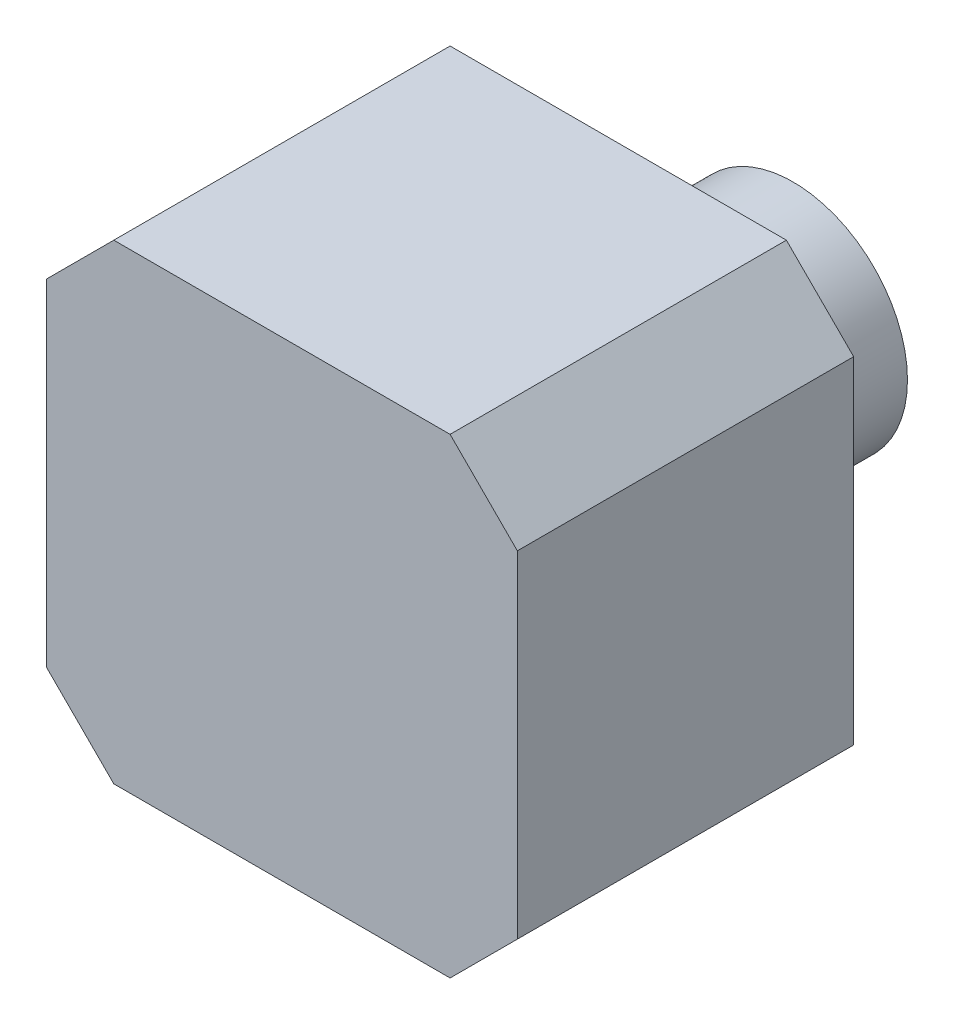
ISO-10303-21;
HEADER;
FILE_DESCRIPTION(('STEP AP214'),'2;1');
FILE_NAME('part.step','',(''),(''),'','','');
FILE_SCHEMA(('AUTOMOTIVE_DESIGN { 1 0 10303 214 1 1 1 1 }'));
ENDSEC;
DATA;
#1=APPLICATION_CONTEXT('core data for automotive mechanical design processes');
#2=APPLICATION_PROTOCOL_DEFINITION('international standard','automotive_design',2000,#1);
#3=PRODUCT_CONTEXT('',#1,'mechanical');
#4=PRODUCT('Part','Part','',(#3));
#5=PRODUCT_RELATED_PRODUCT_CATEGORY('part','',(#4));
#6=PRODUCT_DEFINITION_FORMATION('','',#4);
#7=PRODUCT_DEFINITION_CONTEXT('part definition',#1,'design');
#8=PRODUCT_DEFINITION('design','',#6,#7);
#9=PRODUCT_DEFINITION_SHAPE('','',#8);
#10=(LENGTH_UNIT() NAMED_UNIT(*) SI_UNIT(.MILLI.,.METRE.));
#11=(NAMED_UNIT(*) PLANE_ANGLE_UNIT() SI_UNIT($,.RADIAN.));
#12=(NAMED_UNIT(*) SI_UNIT($,.STERADIAN.) SOLID_ANGLE_UNIT());
#13=UNCERTAINTY_MEASURE_WITH_UNIT(LENGTH_MEASURE(1.E-05),#10,'distance_accuracy_value','');
#14=(GEOMETRIC_REPRESENTATION_CONTEXT(3) GLOBAL_UNCERTAINTY_ASSIGNED_CONTEXT((#13)) GLOBAL_UNIT_ASSIGNED_CONTEXT((#10,
#11,#12)) REPRESENTATION_CONTEXT('',''));
#15=CARTESIAN_POINT('',(0.,0.,0.));
#16=DIRECTION('',(0.,0.,1.));
#17=DIRECTION('',(1.,0.,0.));
#18=AXIS2_PLACEMENT_3D('',#15,#16,#17);
#19=CARTESIAN_POINT('',(0.,0.,-2.));
#20=DIRECTION('',(0.,0.,-1.));
#21=DIRECTION('',(-1.,0.,0.));
#22=AXIS2_PLACEMENT_3D('',#19,#20,#21);
#23=PLANE('',#22);
#24=CARTESIAN_POINT('',(0.,0.,-2.));
#25=DIRECTION('',(0.,0.,-1.));
#26=DIRECTION('',(-1.,0.,0.));
#27=AXIS2_PLACEMENT_3D('',#24,#25,#26);
#28=CIRCLE('',#27,11.);
#29=CARTESIAN_POINT('',(-11.,0.,-2.));
#30=VERTEX_POINT('',#29);
#31=EDGE_CURVE('E166',#30,#30,#28,.T.);
#32=ORIENTED_EDGE('',*,*,#31,.T.);
#33=EDGE_LOOP('',(#32));
#34=FACE_BOUND('',#33,.T.);
#35=CARTESIAN_POINT('',(0.,0.,-2.));
#36=DIRECTION('',(0.,0.,-1.));
#37=DIRECTION('',(-1.,0.,0.));
#38=AXIS2_PLACEMENT_3D('',#35,#36,#37);
#39=CIRCLE('',#38,8.5);
#40=CARTESIAN_POINT('',(-8.5,0.,-2.));
#41=VERTEX_POINT('',#40);
#42=EDGE_CURVE('E180',#41,#41,#39,.T.);
#43=ORIENTED_EDGE('',*,*,#42,.F.);
#44=EDGE_LOOP('',(#43));
#45=FACE_BOUND('',#44,.T.);
#46=ADVANCED_FACE('F35',(#34,#45),#23,.T.);
#47=CARTESIAN_POINT('',(0.,0.,0.));
#48=DIRECTION('',(0.,0.,-1.));
#49=DIRECTION('',(-1.,0.,0.));
#50=AXIS2_PLACEMENT_3D('',#47,#48,#49);
#51=PLANE('',#50);
#52=DIRECTION('',(1.,0.,0.));
#53=VECTOR('',#52,1.);
#54=CARTESIAN_POINT('',(-17.5,-17.5,0.));
#55=LINE('',#54,#53);
#56=CARTESIAN_POINT('',(-12.5,-17.5,0.));
#57=VERTEX_POINT('',#56);
#58=CARTESIAN_POINT('',(12.5,-17.5,0.));
#59=VERTEX_POINT('',#58);
#60=EDGE_CURVE('E118',#57,#59,#55,.T.);
#61=ORIENTED_EDGE('',*,*,#60,.F.);
#62=DIRECTION('',(0.707106781186546,-0.707106781186549,0.));
#63=VECTOR('',#62,1.);
#64=CARTESIAN_POINT('',(-15.,-15.,0.));
#65=LINE('',#64,#63);
#66=CARTESIAN_POINT('',(-17.5,-12.5,0.));
#67=VERTEX_POINT('',#66);
#68=EDGE_CURVE('E101',#57,#67,#65,.F.);
#69=ORIENTED_EDGE('',*,*,#68,.T.);
#70=DIRECTION('',(0.,-1.,0.));
#71=VECTOR('',#70,1.);
#72=CARTESIAN_POINT('',(-17.5,-17.5,0.));
#73=LINE('',#72,#71);
#74=CARTESIAN_POINT('',(-17.5,12.5,0.));
#75=VERTEX_POINT('',#74);
#76=EDGE_CURVE('E129',#75,#67,#73,.T.);
#77=ORIENTED_EDGE('',*,*,#76,.F.);
#78=DIRECTION('',(-0.707106781186549,-0.707106781186546,0.));
#79=VECTOR('',#78,1.);
#80=CARTESIAN_POINT('',(-15.,15.,0.));
#81=LINE('',#80,#79);
#82=CARTESIAN_POINT('',(-12.5,17.5,0.));
#83=VERTEX_POINT('',#82);
#84=EDGE_CURVE('E122',#75,#83,#81,.F.);
#85=ORIENTED_EDGE('',*,*,#84,.T.);
#86=DIRECTION('',(-1.,0.,0.));
#87=VECTOR('',#86,1.);
#88=CARTESIAN_POINT('',(-17.5,17.5,0.));
#89=LINE('',#88,#87);
#90=CARTESIAN_POINT('',(12.5,17.5,0.));
#91=VERTEX_POINT('',#90);
#92=EDGE_CURVE('E133',#91,#83,#89,.T.);
#93=ORIENTED_EDGE('',*,*,#92,.F.);
#94=DIRECTION('',(-0.707106781186546,0.707106781186549,0.));
#95=VECTOR('',#94,1.);
#96=CARTESIAN_POINT('',(15.,15.,0.));
#97=LINE('',#96,#95);
#98=CARTESIAN_POINT('',(17.5,12.5,0.));
#99=VERTEX_POINT('',#98);
#100=EDGE_CURVE('E139',#91,#99,#97,.F.);
#101=ORIENTED_EDGE('',*,*,#100,.T.);
#102=DIRECTION('',(0.,1.,0.));
#103=VECTOR('',#102,1.);
#104=CARTESIAN_POINT('',(17.5,-17.5,0.));
#105=LINE('',#104,#103);
#106=CARTESIAN_POINT('',(17.5,-12.5,0.));
#107=VERTEX_POINT('',#106);
#108=EDGE_CURVE('E161',#107,#99,#105,.T.);
#109=ORIENTED_EDGE('',*,*,#108,.F.);
#110=DIRECTION('',(0.707106781186549,0.707106781186546,0.));
#111=VECTOR('',#110,1.);
#112=CARTESIAN_POINT('',(15.,-15.,0.));
#113=LINE('',#112,#111);
#114=EDGE_CURVE('E112',#107,#59,#113,.F.);
#115=ORIENTED_EDGE('',*,*,#114,.T.);
#116=EDGE_LOOP('',(#61,#69,#77,#85,#93,#101,#109,#115));
#117=FACE_BOUND('',#116,.T.);
#118=CARTESIAN_POINT('',(0.,0.,0.));
#119=DIRECTION('',(0.,0.,-1.));
#120=DIRECTION('',(-1.,0.,0.));
#121=AXIS2_PLACEMENT_3D('',#118,#119,#120);
#122=CIRCLE('',#121,11.);
#123=CARTESIAN_POINT('',(-11.,0.,0.));
#124=VERTEX_POINT('',#123);
#125=EDGE_CURVE('E169',#124,#124,#122,.T.);
#126=ORIENTED_EDGE('',*,*,#125,.F.);
#127=EDGE_LOOP('',(#126));
#128=FACE_BOUND('',#127,.T.);
#129=ADVANCED_FACE('F125',(#117,#128),#51,.T.);
#130=CARTESIAN_POINT('',(17.5,-17.5,25.));
#131=DIRECTION('',(-1.,0.,0.));
#132=DIRECTION('',(0.,0.,1.));
#133=AXIS2_PLACEMENT_3D('',#130,#131,#132);
#134=PLANE('',#133);
#135=DIRECTION('',(0.,1.,0.));
#136=VECTOR('',#135,1.);
#137=CARTESIAN_POINT('',(17.5,-17.5,25.));
#138=LINE('',#137,#136);
#139=CARTESIAN_POINT('',(17.5,-12.5,25.));
#140=VERTEX_POINT('',#139);
#141=CARTESIAN_POINT('',(17.5,12.5,25.));
#142=VERTEX_POINT('',#141);
#143=EDGE_CURVE('E128',#140,#142,#138,.T.);
#144=ORIENTED_EDGE('',*,*,#143,.F.);
#145=DIRECTION('',(0.,0.,-1.));
#146=VECTOR('',#145,1.);
#147=CARTESIAN_POINT('',(17.5,-12.5,25.));
#148=LINE('',#147,#146);
#149=EDGE_CURVE('E154',#140,#107,#148,.T.);
#150=ORIENTED_EDGE('',*,*,#149,.T.);
#151=ORIENTED_EDGE('',*,*,#108,.T.);
#152=DIRECTION('',(0.,0.,1.));
#153=VECTOR('',#152,1.);
#154=CARTESIAN_POINT('',(17.5,12.5,25.));
#155=LINE('',#154,#153);
#156=EDGE_CURVE('E152',#99,#142,#155,.T.);
#157=ORIENTED_EDGE('',*,*,#156,.T.);
#158=EDGE_LOOP('',(#144,#150,#151,#157));
#159=FACE_BOUND('',#158,.T.);
#160=ADVANCED_FACE('F160',(#159),#134,.F.);
#161=CARTESIAN_POINT('',(-17.5,17.5,25.));
#162=DIRECTION('',(0.,-1.,0.));
#163=DIRECTION('',(0.,0.,-1.));
#164=AXIS2_PLACEMENT_3D('',#161,#162,#163);
#165=PLANE('',#164);
#166=DIRECTION('',(-1.,0.,0.));
#167=VECTOR('',#166,1.);
#168=CARTESIAN_POINT('',(-17.5,17.5,25.));
#169=LINE('',#168,#167);
#170=CARTESIAN_POINT('',(12.5,17.5,25.));
#171=VERTEX_POINT('',#170);
#172=CARTESIAN_POINT('',(-12.5,17.5,25.));
#173=VERTEX_POINT('',#172);
#174=EDGE_CURVE('E131',#171,#173,#169,.T.);
#175=ORIENTED_EDGE('',*,*,#174,.F.);
#176=DIRECTION('',(0.,0.,-1.));
#177=VECTOR('',#176,1.);
#178=CARTESIAN_POINT('',(12.5,17.5,25.));
#179=LINE('',#178,#177);
#180=EDGE_CURVE('E11',#171,#91,#179,.T.);
#181=ORIENTED_EDGE('',*,*,#180,.T.);
#182=ORIENTED_EDGE('',*,*,#92,.T.);
#183=DIRECTION('',(0.,0.,1.));
#184=VECTOR('',#183,1.);
#185=CARTESIAN_POINT('',(-12.5,17.5,25.));
#186=LINE('',#185,#184);
#187=EDGE_CURVE('E43',#83,#173,#186,.T.);
#188=ORIENTED_EDGE('',*,*,#187,.T.);
#189=EDGE_LOOP('',(#175,#181,#182,#188));
#190=FACE_BOUND('',#189,.T.);
#191=ADVANCED_FACE('F215',(#190),#165,.F.);
#192=CARTESIAN_POINT('',(-17.5,-17.5,25.));
#193=DIRECTION('',(1.,0.,0.));
#194=DIRECTION('',(0.,0.,-1.));
#195=AXIS2_PLACEMENT_3D('',#192,#193,#194);
#196=PLANE('',#195);
#197=ORIENTED_EDGE('',*,*,#76,.T.);
#198=DIRECTION('',(0.,0.,1.));
#199=VECTOR('',#198,1.);
#200=CARTESIAN_POINT('',(-17.5,-12.5,25.));
#201=LINE('',#200,#199);
#202=CARTESIAN_POINT('',(-17.5,-12.5,25.));
#203=VERTEX_POINT('',#202);
#204=EDGE_CURVE('E106',#67,#203,#201,.T.);
#205=ORIENTED_EDGE('',*,*,#204,.T.);
#206=DIRECTION('',(0.,-1.,0.));
#207=VECTOR('',#206,1.);
#208=CARTESIAN_POINT('',(-17.5,-17.5,25.));
#209=LINE('',#208,#207);
#210=CARTESIAN_POINT('',(-17.5,12.5,25.));
#211=VERTEX_POINT('',#210);
#212=EDGE_CURVE('E173',#211,#203,#209,.T.);
#213=ORIENTED_EDGE('',*,*,#212,.F.);
#214=DIRECTION('',(0.,0.,-1.));
#215=VECTOR('',#214,1.);
#216=CARTESIAN_POINT('',(-17.5,12.5,25.));
#217=LINE('',#216,#215);
#218=EDGE_CURVE('E111',#211,#75,#217,.T.);
#219=ORIENTED_EDGE('',*,*,#218,.T.);
#220=EDGE_LOOP('',(#197,#205,#213,#219));
#221=FACE_BOUND('',#220,.T.);
#222=ADVANCED_FACE('F212',(#221),#196,.F.);
#223=CARTESIAN_POINT('',(-17.5,-17.5,25.));
#224=DIRECTION('',(0.,1.,0.));
#225=DIRECTION('',(0.,0.,1.));
#226=AXIS2_PLACEMENT_3D('',#223,#224,#225);
#227=PLANE('',#226);
#228=DIRECTION('',(1.,0.,0.));
#229=VECTOR('',#228,1.);
#230=CARTESIAN_POINT('',(-17.5,-17.5,25.));
#231=LINE('',#230,#229);
#232=CARTESIAN_POINT('',(-12.5,-17.5,25.));
#233=VERTEX_POINT('',#232);
#234=CARTESIAN_POINT('',(12.5,-17.5,25.));
#235=VERTEX_POINT('',#234);
#236=EDGE_CURVE('E121',#233,#235,#231,.T.);
#237=ORIENTED_EDGE('',*,*,#236,.F.);
#238=DIRECTION('',(0.,0.,-1.));
#239=VECTOR('',#238,1.);
#240=CARTESIAN_POINT('',(-12.5,-17.5,25.));
#241=LINE('',#240,#239);
#242=EDGE_CURVE('E105',#233,#57,#241,.T.);
#243=ORIENTED_EDGE('',*,*,#242,.T.);
#244=ORIENTED_EDGE('',*,*,#60,.T.);
#245=DIRECTION('',(0.,0.,1.));
#246=VECTOR('',#245,1.);
#247=CARTESIAN_POINT('',(12.5,-17.5,25.));
#248=LINE('',#247,#246);
#249=EDGE_CURVE('E123',#59,#235,#248,.T.);
#250=ORIENTED_EDGE('',*,*,#249,.T.);
#251=EDGE_LOOP('',(#237,#243,#244,#250));
#252=FACE_BOUND('',#251,.T.);
#253=ADVANCED_FACE('F117',(#252),#227,.F.);
#254=CARTESIAN_POINT('',(0.,0.,25.));
#255=DIRECTION('',(0.,0.,-1.));
#256=DIRECTION('',(-1.,0.,0.));
#257=AXIS2_PLACEMENT_3D('',#254,#255,#256);
#258=PLANE('',#257);
#259=ORIENTED_EDGE('',*,*,#212,.T.);
#260=DIRECTION('',(-0.707106781186546,0.707106781186549,0.));
#261=VECTOR('',#260,1.);
#262=CARTESIAN_POINT('',(-12.5,-17.5,25.));
#263=LINE('',#262,#261);
#264=EDGE_CURVE('E150',#203,#233,#263,.F.);
#265=ORIENTED_EDGE('',*,*,#264,.T.);
#266=ORIENTED_EDGE('',*,*,#236,.T.);
#267=DIRECTION('',(-0.707106781186549,-0.707106781186546,0.));
#268=VECTOR('',#267,1.);
#269=CARTESIAN_POINT('',(17.5,-12.5,25.));
#270=LINE('',#269,#268);
#271=EDGE_CURVE('E148',#235,#140,#270,.F.);
#272=ORIENTED_EDGE('',*,*,#271,.T.);
#273=ORIENTED_EDGE('',*,*,#143,.T.);
#274=DIRECTION('',(0.707106781186546,-0.707106781186549,0.));
#275=VECTOR('',#274,1.);
#276=CARTESIAN_POINT('',(12.5,17.5,25.));
#277=LINE('',#276,#275);
#278=EDGE_CURVE('E56',#142,#171,#277,.F.);
#279=ORIENTED_EDGE('',*,*,#278,.T.);
#280=ORIENTED_EDGE('',*,*,#174,.T.);
#281=DIRECTION('',(0.707106781186549,0.707106781186546,0.));
#282=VECTOR('',#281,1.);
#283=CARTESIAN_POINT('',(-17.5,12.5,25.));
#284=LINE('',#283,#282);
#285=EDGE_CURVE('E145',#173,#211,#284,.F.);
#286=ORIENTED_EDGE('',*,*,#285,.T.);
#287=EDGE_LOOP('',(#259,#265,#266,#272,#273,#279,#280,#286));
#288=FACE_BOUND('',#287,.T.);
#289=ADVANCED_FACE('F207',(#288),#258,.F.);
#290=CARTESIAN_POINT('',(-12.5,-17.5,25.));
#291=DIRECTION('',(0.707106781186549,0.707106781186546,0.));
#292=DIRECTION('',(0.,0.,-1.));
#293=AXIS2_PLACEMENT_3D('',#290,#291,#292);
#294=PLANE('',#293);
#295=ORIENTED_EDGE('',*,*,#264,.F.);
#296=ORIENTED_EDGE('',*,*,#204,.F.);
#297=ORIENTED_EDGE('',*,*,#68,.F.);
#298=ORIENTED_EDGE('',*,*,#242,.F.);
#299=EDGE_LOOP('',(#295,#296,#297,#298));
#300=FACE_BOUND('',#299,.T.);
#301=ADVANCED_FACE('F104',(#300),#294,.F.);
#302=CARTESIAN_POINT('',(17.5,-12.5,25.));
#303=DIRECTION('',(-0.707106781186546,0.707106781186549,0.));
#304=DIRECTION('',(0.,0.,-1.));
#305=AXIS2_PLACEMENT_3D('',#302,#303,#304);
#306=PLANE('',#305);
#307=ORIENTED_EDGE('',*,*,#271,.F.);
#308=ORIENTED_EDGE('',*,*,#249,.F.);
#309=ORIENTED_EDGE('',*,*,#114,.F.);
#310=ORIENTED_EDGE('',*,*,#149,.F.);
#311=EDGE_LOOP('',(#307,#308,#309,#310));
#312=FACE_BOUND('',#311,.T.);
#313=ADVANCED_FACE('F223',(#312),#306,.F.);
#314=CARTESIAN_POINT('',(12.5,17.5,25.));
#315=DIRECTION('',(-0.707106781186549,-0.707106781186546,0.));
#316=DIRECTION('',(0.,0.,-1.));
#317=AXIS2_PLACEMENT_3D('',#314,#315,#316);
#318=PLANE('',#317);
#319=ORIENTED_EDGE('',*,*,#278,.F.);
#320=ORIENTED_EDGE('',*,*,#156,.F.);
#321=ORIENTED_EDGE('',*,*,#100,.F.);
#322=ORIENTED_EDGE('',*,*,#180,.F.);
#323=EDGE_LOOP('',(#319,#320,#321,#322));
#324=FACE_BOUND('',#323,.T.);
#325=ADVANCED_FACE('F225',(#324),#318,.F.);
#326=CARTESIAN_POINT('',(-17.5,12.5,25.));
#327=DIRECTION('',(0.707106781186546,-0.707106781186549,0.));
#328=DIRECTION('',(0.,0.,-1.));
#329=AXIS2_PLACEMENT_3D('',#326,#327,#328);
#330=PLANE('',#329);
#331=ORIENTED_EDGE('',*,*,#285,.F.);
#332=ORIENTED_EDGE('',*,*,#187,.F.);
#333=ORIENTED_EDGE('',*,*,#84,.F.);
#334=ORIENTED_EDGE('',*,*,#218,.F.);
#335=EDGE_LOOP('',(#331,#332,#333,#334));
#336=FACE_BOUND('',#335,.T.);
#337=ADVANCED_FACE('F37',(#336),#330,.F.);
#338=CARTESIAN_POINT('',(0.,0.,-2.));
#339=DIRECTION('',(0.,0.,1.));
#340=DIRECTION('',(1.,0.,0.));
#341=AXIS2_PLACEMENT_3D('',#338,#339,#340);
#342=CYLINDRICAL_SURFACE('',#341,11.);
#343=ORIENTED_EDGE('',*,*,#31,.F.);
#344=EDGE_LOOP('',(#343));
#345=FACE_BOUND('',#344,.T.);
#346=ORIENTED_EDGE('',*,*,#125,.T.);
#347=EDGE_LOOP('',(#346));
#348=FACE_BOUND('',#347,.T.);
#349=ADVANCED_FACE('F191',(#345,#348),#342,.T.);
#350=CARTESIAN_POINT('',(0.,0.,-13.));
#351=DIRECTION('',(0.,0.,1.));
#352=DIRECTION('',(1.,0.,0.));
#353=AXIS2_PLACEMENT_3D('',#350,#351,#352);
#354=CYLINDRICAL_SURFACE('',#353,8.5);
#355=CARTESIAN_POINT('',(0.,0.,-13.));
#356=DIRECTION('',(0.,0.,-1.));
#357=DIRECTION('',(-1.,0.,0.));
#358=AXIS2_PLACEMENT_3D('',#355,#356,#357);
#359=CIRCLE('',#358,8.5);
#360=CARTESIAN_POINT('',(-8.5,0.,-13.));
#361=VERTEX_POINT('',#360);
#362=EDGE_CURVE('E178',#361,#361,#359,.T.);
#363=ORIENTED_EDGE('',*,*,#362,.F.);
#364=EDGE_LOOP('',(#363));
#365=FACE_BOUND('',#364,.T.);
#366=ORIENTED_EDGE('',*,*,#42,.T.);
#367=EDGE_LOOP('',(#366));
#368=FACE_BOUND('',#367,.T.);
#369=ADVANCED_FACE('F188',(#365,#368),#354,.T.);
#370=CARTESIAN_POINT('',(0.,0.,-13.));
#371=DIRECTION('',(0.,0.,-1.));
#372=DIRECTION('',(-1.,0.,0.));
#373=AXIS2_PLACEMENT_3D('',#370,#371,#372);
#374=PLANE('',#373);
#375=ORIENTED_EDGE('',*,*,#362,.T.);
#376=EDGE_LOOP('',(#375));
#377=FACE_BOUND('',#376,.T.);
#378=ADVANCED_FACE('F186',(#377),#374,.T.);
#379=CLOSED_SHELL('',(#46,#129,#160,#191,#222,#253,#289,#301,#313,#325,#337,#349,#369,#378));
#380=MANIFOLD_SOLID_BREP('B2',#379);
#381=ADVANCED_BREP_SHAPE_REPRESENTATION('',(#18,#380),#14);
#382=SHAPE_DEFINITION_REPRESENTATION(#9,#381);
ENDSEC;
END-ISO-10303-21;
